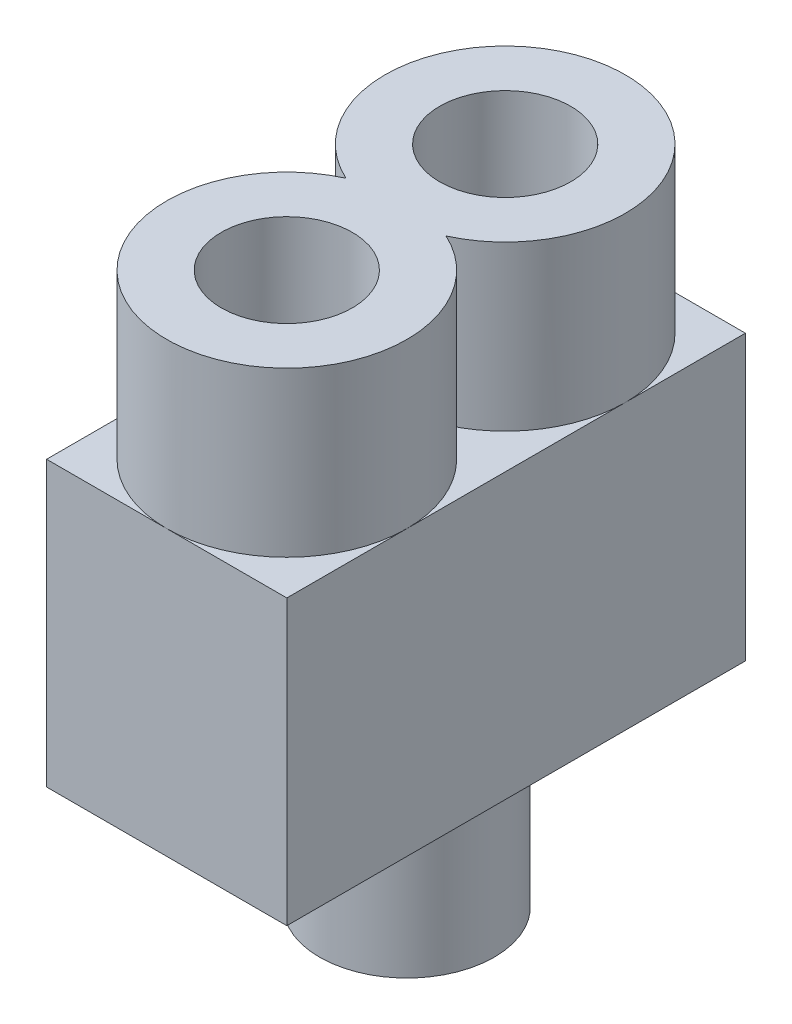
ISO-10303-21;
HEADER;
FILE_DESCRIPTION(('STEP AP214'),'2;1');
FILE_NAME('part.step','',(''),(''),'','','');
FILE_SCHEMA(('AUTOMOTIVE_DESIGN { 1 0 10303 214 1 1 1 1 }'));
ENDSEC;
DATA;
#1=APPLICATION_CONTEXT('core data for automotive mechanical design processes');
#2=APPLICATION_PROTOCOL_DEFINITION('international standard','automotive_design',2000,#1);
#3=PRODUCT_CONTEXT('',#1,'mechanical');
#4=PRODUCT('Part','Part','',(#3));
#5=PRODUCT_RELATED_PRODUCT_CATEGORY('part','',(#4));
#6=PRODUCT_DEFINITION_FORMATION('','',#4);
#7=PRODUCT_DEFINITION_CONTEXT('part definition',#1,'design');
#8=PRODUCT_DEFINITION('design','',#6,#7);
#9=PRODUCT_DEFINITION_SHAPE('','',#8);
#10=(LENGTH_UNIT() NAMED_UNIT(*) SI_UNIT(.MILLI.,.METRE.));
#11=(NAMED_UNIT(*) PLANE_ANGLE_UNIT() SI_UNIT($,.RADIAN.));
#12=(NAMED_UNIT(*) SI_UNIT($,.STERADIAN.) SOLID_ANGLE_UNIT());
#13=UNCERTAINTY_MEASURE_WITH_UNIT(LENGTH_MEASURE(1.E-05),#10,'distance_accuracy_value','');
#14=(GEOMETRIC_REPRESENTATION_CONTEXT(3) GLOBAL_UNCERTAINTY_ASSIGNED_CONTEXT((#13)) GLOBAL_UNIT_ASSIGNED_CONTEXT((#10,
#11,#12)) REPRESENTATION_CONTEXT('',''));
#15=CARTESIAN_POINT('',(0.,0.,0.));
#16=DIRECTION('',(0.,0.,1.));
#17=DIRECTION('',(1.,0.,0.));
#18=AXIS2_PLACEMENT_3D('',#15,#16,#17);
#19=CARTESIAN_POINT('',(-11.,15.,-11.));
#20=DIRECTION('',(0.,1.,0.));
#21=DIRECTION('',(0.,0.,1.));
#22=AXIS2_PLACEMENT_3D('',#19,#20,#21);
#23=PLANE('',#22);
#24=CARTESIAN_POINT('',(0.,15.,9.));
#25=DIRECTION('',(0.,-1.,0.));
#26=DIRECTION('',(0.,0.,-1.));
#27=AXIS2_PLACEMENT_3D('',#24,#25,#26);
#28=CIRCLE('',#27,6.);
#29=CARTESIAN_POINT('',(0.,15.,3.));
#30=VERTEX_POINT('',#29);
#31=EDGE_CURVE('E151',#30,#30,#28,.T.);
#32=ORIENTED_EDGE('',*,*,#31,.T.);
#33=EDGE_LOOP('',(#32));
#34=FACE_BOUND('',#33,.T.);
#35=ADVANCED_FACE('F69',(#34),#23,.F.);
#36=CARTESIAN_POINT('',(-11.,41.,-11.));
#37=DIRECTION('',(0.,1.,0.));
#38=DIRECTION('',(0.,0.,1.));
#39=AXIS2_PLACEMENT_3D('',#36,#37,#38);
#40=PLANE('',#39);
#41=DIRECTION('',(0.,0.,-1.));
#42=VECTOR('',#41,1.);
#43=CARTESIAN_POINT('',(11.,41.,11.));
#44=LINE('',#43,#42);
#45=CARTESIAN_POINT('',(11.,41.,20.));
#46=VERTEX_POINT('',#45);
#47=CARTESIAN_POINT('',(11.,41.,0.));
#48=VERTEX_POINT('',#47);
#49=EDGE_CURVE('E84',#46,#48,#44,.T.);
#50=ORIENTED_EDGE('',*,*,#49,.T.);
#51=CARTESIAN_POINT('',(0.,41.,0.));
#52=DIRECTION('',(0.,-1.,0.));
#53=DIRECTION('',(1.,0.,0.));
#54=AXIS2_PLACEMENT_3D('',#51,#52,#53);
#55=CIRCLE('',#54,11.);
#56=CARTESIAN_POINT('',(4.58257569495584,41.,10.));
#57=VERTEX_POINT('',#56);
#58=EDGE_CURVE('E164',#48,#57,#55,.T.);
#59=ORIENTED_EDGE('',*,*,#58,.T.);
#60=CARTESIAN_POINT('',(0.,41.,20.));
#61=DIRECTION('',(0.,-1.,0.));
#62=DIRECTION('',(1.,0.,0.));
#63=AXIS2_PLACEMENT_3D('',#60,#61,#62);
#64=CIRCLE('',#63,11.);
#65=EDGE_CURVE('E188',#57,#46,#64,.T.);
#66=ORIENTED_EDGE('',*,*,#65,.T.);
#67=EDGE_LOOP('',(#50,#59,#66));
#68=FACE_BOUND('',#67,.T.);
#69=ADVANCED_FACE('F238',(#68),#40,.T.);
#70=CARTESIAN_POINT('',(-4.58257569495584,41.,10.));
#71=VERTEX_POINT('',#70);
#72=CARTESIAN_POINT('',(-11.,41.,0.));
#73=VERTEX_POINT('',#72);
#74=EDGE_CURVE('E156',#71,#73,#55,.T.);
#75=ORIENTED_EDGE('',*,*,#74,.T.);
#76=DIRECTION('',(0.,0.,1.));
#77=VECTOR('',#76,1.);
#78=CARTESIAN_POINT('',(-11.,41.,-11.));
#79=LINE('',#78,#77);
#80=CARTESIAN_POINT('',(-11.,41.,20.));
#81=VERTEX_POINT('',#80);
#82=EDGE_CURVE('E136',#73,#81,#79,.T.);
#83=ORIENTED_EDGE('',*,*,#82,.T.);
#84=EDGE_CURVE('E316',#81,#71,#64,.T.);
#85=ORIENTED_EDGE('',*,*,#84,.T.);
#86=EDGE_LOOP('',(#75,#83,#85));
#87=FACE_BOUND('',#86,.T.);
#88=ADVANCED_FACE('F246',(#87),#40,.T.);
#89=CARTESIAN_POINT('',(-11.,41.,-11.));
#90=VERTEX_POINT('',#89);
#91=EDGE_CURVE('E141',#90,#73,#79,.T.);
#92=ORIENTED_EDGE('',*,*,#91,.T.);
#93=CARTESIAN_POINT('',(0.,41.,-11.));
#94=VERTEX_POINT('',#93);
#95=EDGE_CURVE('E349',#73,#94,#55,.T.);
#96=ORIENTED_EDGE('',*,*,#95,.T.);
#97=DIRECTION('',(-1.,0.,0.));
#98=VECTOR('',#97,1.);
#99=CARTESIAN_POINT('',(11.,41.,-11.));
#100=LINE('',#99,#98);
#101=EDGE_CURVE('E168',#94,#90,#100,.T.);
#102=ORIENTED_EDGE('',*,*,#101,.T.);
#103=EDGE_LOOP('',(#92,#96,#102));
#104=FACE_BOUND('',#103,.T.);
#105=ADVANCED_FACE('F256',(#104),#40,.T.);
#106=CARTESIAN_POINT('',(11.,41.,-11.));
#107=VERTEX_POINT('',#106);
#108=EDGE_CURVE('E129',#107,#94,#100,.T.);
#109=ORIENTED_EDGE('',*,*,#108,.T.);
#110=EDGE_CURVE('E145',#94,#48,#55,.T.);
#111=ORIENTED_EDGE('',*,*,#110,.T.);
#112=EDGE_CURVE('E93',#48,#107,#44,.T.);
#113=ORIENTED_EDGE('',*,*,#112,.T.);
#114=EDGE_LOOP('',(#109,#111,#113));
#115=FACE_BOUND('',#114,.T.);
#116=ADVANCED_FACE('F248',(#115),#40,.T.);
#117=CARTESIAN_POINT('',(0.,15.,9.));
#118=DIRECTION('',(0.,-1.,0.));
#119=DIRECTION('',(1.,0.,0.));
#120=AXIS2_PLACEMENT_3D('',#117,#118,#119);
#121=CIRCLE('',#120,8.);
#122=CARTESIAN_POINT('',(8.,15.,9.));
#123=VERTEX_POINT('',#122);
#124=EDGE_CURVE('E147',#123,#123,#121,.T.);
#125=ORIENTED_EDGE('',*,*,#124,.F.);
#126=EDGE_LOOP('',(#125));
#127=FACE_BOUND('',#126,.T.);
#128=DIRECTION('',(1.,0.,0.));
#129=VECTOR('',#128,1.);
#130=CARTESIAN_POINT('',(0.,15.,31.));
#131=LINE('',#130,#129);
#132=CARTESIAN_POINT('',(-11.,15.,31.));
#133=VERTEX_POINT('',#132);
#134=CARTESIAN_POINT('',(11.,15.,31.));
#135=VERTEX_POINT('',#134);
#136=EDGE_CURVE('E184',#133,#135,#131,.T.);
#137=ORIENTED_EDGE('',*,*,#136,.F.);
#138=DIRECTION('',(0.,0.,1.));
#139=VECTOR('',#138,1.);
#140=CARTESIAN_POINT('',(-11.,15.,0.));
#141=LINE('',#140,#139);
#142=CARTESIAN_POINT('',(-11.,15.,-11.));
#143=VERTEX_POINT('',#142);
#144=EDGE_CURVE('E122',#143,#133,#141,.T.);
#145=ORIENTED_EDGE('',*,*,#144,.F.);
#146=DIRECTION('',(-1.,0.,0.));
#147=VECTOR('',#146,1.);
#148=CARTESIAN_POINT('',(11.,15.,-11.));
#149=LINE('',#148,#147);
#150=CARTESIAN_POINT('',(11.,15.,-11.));
#151=VERTEX_POINT('',#150);
#152=EDGE_CURVE('E121',#151,#143,#149,.T.);
#153=ORIENTED_EDGE('',*,*,#152,.F.);
#154=DIRECTION('',(0.,0.,-1.));
#155=VECTOR('',#154,1.);
#156=CARTESIAN_POINT('',(11.,15.,0.));
#157=LINE('',#156,#155);
#158=EDGE_CURVE('E107',#135,#151,#157,.T.);
#159=ORIENTED_EDGE('',*,*,#158,.F.);
#160=EDGE_LOOP('',(#137,#145,#153,#159));
#161=FACE_BOUND('',#160,.T.);
#162=ADVANCED_FACE('F132',(#127,#161),#23,.F.);
#163=CARTESIAN_POINT('',(-11.,41.,0.));
#164=DIRECTION('',(1.,0.,0.));
#165=DIRECTION('',(0.,0.,-1.));
#166=AXIS2_PLACEMENT_3D('',#163,#164,#165);
#167=PLANE('',#166);
#168=DIRECTION('',(0.,0.,1.));
#169=VECTOR('',#168,1.);
#170=CARTESIAN_POINT('',(-11.,41.,9.));
#171=LINE('',#170,#169);
#172=CARTESIAN_POINT('',(-11.,41.,31.));
#173=VERTEX_POINT('',#172);
#174=EDGE_CURVE('E191',#81,#173,#171,.T.);
#175=ORIENTED_EDGE('',*,*,#174,.F.);
#176=ORIENTED_EDGE('',*,*,#82,.F.);
#177=ORIENTED_EDGE('',*,*,#91,.F.);
#178=DIRECTION('',(0.,-1.,0.));
#179=VECTOR('',#178,1.);
#180=CARTESIAN_POINT('',(-11.,41.,-11.));
#181=LINE('',#180,#179);
#182=EDGE_CURVE('E130',#90,#143,#181,.T.);
#183=ORIENTED_EDGE('',*,*,#182,.T.);
#184=ORIENTED_EDGE('',*,*,#144,.T.);
#185=DIRECTION('',(0.,-1.,0.));
#186=VECTOR('',#185,1.);
#187=CARTESIAN_POINT('',(-11.,41.,31.));
#188=LINE('',#187,#186);
#189=EDGE_CURVE('E177',#173,#133,#188,.T.);
#190=ORIENTED_EDGE('',*,*,#189,.F.);
#191=EDGE_LOOP('',(#175,#176,#177,#183,#184,#190));
#192=FACE_BOUND('',#191,.T.);
#193=ADVANCED_FACE('F71',(#192),#167,.F.);
#194=CARTESIAN_POINT('',(11.,41.,0.));
#195=DIRECTION('',(-1.,0.,0.));
#196=DIRECTION('',(0.,0.,1.));
#197=AXIS2_PLACEMENT_3D('',#194,#195,#196);
#198=PLANE('',#197);
#199=ORIENTED_EDGE('',*,*,#158,.T.);
#200=DIRECTION('',(0.,-1.,0.));
#201=VECTOR('',#200,1.);
#202=CARTESIAN_POINT('',(11.,41.,-11.));
#203=LINE('',#202,#201);
#204=EDGE_CURVE('E110',#107,#151,#203,.T.);
#205=ORIENTED_EDGE('',*,*,#204,.F.);
#206=ORIENTED_EDGE('',*,*,#112,.F.);
#207=ORIENTED_EDGE('',*,*,#49,.F.);
#208=DIRECTION('',(0.,0.,-1.));
#209=VECTOR('',#208,1.);
#210=CARTESIAN_POINT('',(11.,41.,31.));
#211=LINE('',#210,#209);
#212=CARTESIAN_POINT('',(11.,41.,31.));
#213=VERTEX_POINT('',#212);
#214=EDGE_CURVE('E204',#213,#46,#211,.T.);
#215=ORIENTED_EDGE('',*,*,#214,.F.);
#216=DIRECTION('',(0.,-1.,0.));
#217=VECTOR('',#216,1.);
#218=CARTESIAN_POINT('',(11.,41.,31.));
#219=LINE('',#218,#217);
#220=EDGE_CURVE('E115',#213,#135,#219,.T.);
#221=ORIENTED_EDGE('',*,*,#220,.T.);
#222=EDGE_LOOP('',(#199,#205,#206,#207,#215,#221));
#223=FACE_BOUND('',#222,.T.);
#224=ADVANCED_FACE('F109',(#223),#198,.F.);
#225=CARTESIAN_POINT('',(11.,41.,-11.));
#226=DIRECTION('',(0.,0.,1.));
#227=DIRECTION('',(1.,0.,0.));
#228=AXIS2_PLACEMENT_3D('',#225,#226,#227);
#229=PLANE('',#228);
#230=ORIENTED_EDGE('',*,*,#152,.T.);
#231=ORIENTED_EDGE('',*,*,#182,.F.);
#232=ORIENTED_EDGE('',*,*,#101,.F.);
#233=ORIENTED_EDGE('',*,*,#108,.F.);
#234=ORIENTED_EDGE('',*,*,#204,.T.);
#235=EDGE_LOOP('',(#230,#231,#232,#233,#234));
#236=FACE_BOUND('',#235,.T.);
#237=ADVANCED_FACE('F125',(#236),#229,.F.);
#238=CARTESIAN_POINT('',(0.,56.,0.));
#239=DIRECTION('',(0.,-1.,0.));
#240=DIRECTION('',(0.,0.,-1.));
#241=AXIS2_PLACEMENT_3D('',#238,#239,#240);
#242=CYLINDRICAL_SURFACE('',#241,11.);
#243=DIRECTION('',(0.,-1.,0.));
#244=VECTOR('',#243,1.);
#245=CARTESIAN_POINT('',(-4.58257569495584,48.5,10.));
#246=LINE('',#245,#244);
#247=CARTESIAN_POINT('',(-4.58257569495584,56.,10.));
#248=VERTEX_POINT('',#247);
#249=EDGE_CURVE('E210',#248,#71,#246,.T.);
#250=ORIENTED_EDGE('',*,*,#249,.F.);
#251=CARTESIAN_POINT('',(0.,56.,0.));
#252=DIRECTION('',(0.,-1.,0.));
#253=DIRECTION('',(-1.,0.,0.));
#254=AXIS2_PLACEMENT_3D('',#251,#252,#253);
#255=CIRCLE('',#254,11.);
#256=CARTESIAN_POINT('',(4.58257569495584,56.,10.));
#257=VERTEX_POINT('',#256);
#258=EDGE_CURVE('E161',#248,#257,#255,.T.);
#259=ORIENTED_EDGE('',*,*,#258,.T.);
#260=DIRECTION('',(0.,-1.,0.));
#261=VECTOR('',#260,1.);
#262=CARTESIAN_POINT('',(4.58257569495584,48.5,10.));
#263=LINE('',#262,#261);
#264=EDGE_CURVE('E207',#57,#257,#263,.F.);
#265=ORIENTED_EDGE('',*,*,#264,.F.);
#266=ORIENTED_EDGE('',*,*,#58,.F.);
#267=ORIENTED_EDGE('',*,*,#110,.F.);
#268=ORIENTED_EDGE('',*,*,#95,.F.);
#269=ORIENTED_EDGE('',*,*,#74,.F.);
#270=EDGE_LOOP('',(#250,#259,#265,#266,#267,#268,#269));
#271=FACE_BOUND('',#270,.T.);
#272=ADVANCED_FACE('F263',(#271),#242,.T.);
#273=CARTESIAN_POINT('',(0.,56.,0.));
#274=DIRECTION('',(0.,-1.,0.));
#275=DIRECTION('',(0.,0.,-1.));
#276=AXIS2_PLACEMENT_3D('',#273,#274,#275);
#277=PLANE('',#276);
#278=ORIENTED_EDGE('',*,*,#258,.F.);
#279=CARTESIAN_POINT('',(0.,56.,20.));
#280=DIRECTION('',(0.,-1.,0.));
#281=DIRECTION('',(-1.,0.,0.));
#282=AXIS2_PLACEMENT_3D('',#279,#280,#281);
#283=CIRCLE('',#282,11.);
#284=EDGE_CURVE('E192',#257,#248,#283,.T.);
#285=ORIENTED_EDGE('',*,*,#284,.F.);
#286=EDGE_LOOP('',(#278,#285));
#287=FACE_BOUND('',#286,.T.);
#288=CARTESIAN_POINT('',(0.,56.,20.));
#289=DIRECTION('',(0.,1.,0.));
#290=DIRECTION('',(0.,0.,1.));
#291=AXIS2_PLACEMENT_3D('',#288,#289,#290);
#292=CIRCLE('',#291,6.);
#293=CARTESIAN_POINT('',(0.,56.,26.));
#294=VERTEX_POINT('',#293);
#295=EDGE_CURVE('E315',#294,#294,#292,.T.);
#296=ORIENTED_EDGE('',*,*,#295,.F.);
#297=EDGE_LOOP('',(#296));
#298=FACE_BOUND('',#297,.T.);
#299=CARTESIAN_POINT('',(0.,56.,0.));
#300=DIRECTION('',(0.,1.,0.));
#301=DIRECTION('',(0.,0.,1.));
#302=AXIS2_PLACEMENT_3D('',#299,#300,#301);
#303=CIRCLE('',#302,6.);
#304=CARTESIAN_POINT('',(0.,56.,6.));
#305=VERTEX_POINT('',#304);
#306=EDGE_CURVE('E320',#305,#305,#303,.T.);
#307=ORIENTED_EDGE('',*,*,#306,.F.);
#308=EDGE_LOOP('',(#307));
#309=FACE_BOUND('',#308,.T.);
#310=ADVANCED_FACE('F234',(#287,#298,#309),#277,.F.);
#311=CARTESIAN_POINT('',(0.,0.,9.));
#312=DIRECTION('',(0.,-1.,0.));
#313=DIRECTION('',(0.,0.,-1.));
#314=AXIS2_PLACEMENT_3D('',#311,#312,#313);
#315=PLANE('',#314);
#316=CARTESIAN_POINT('',(0.,0.,9.));
#317=DIRECTION('',(0.,-1.,0.));
#318=DIRECTION('',(1.,0.,0.));
#319=AXIS2_PLACEMENT_3D('',#316,#317,#318);
#320=CIRCLE('',#319,8.);
#321=CARTESIAN_POINT('',(8.,0.,9.));
#322=VERTEX_POINT('',#321);
#323=EDGE_CURVE('E160',#322,#322,#320,.T.);
#324=ORIENTED_EDGE('',*,*,#323,.T.);
#325=EDGE_LOOP('',(#324));
#326=FACE_BOUND('',#325,.T.);
#327=CARTESIAN_POINT('',(0.,0.,9.));
#328=DIRECTION('',(0.,-1.,0.));
#329=DIRECTION('',(0.,0.,-1.));
#330=AXIS2_PLACEMENT_3D('',#327,#328,#329);
#331=CIRCLE('',#330,6.);
#332=CARTESIAN_POINT('',(0.,0.,3.));
#333=VERTEX_POINT('',#332);
#334=EDGE_CURVE('E214',#333,#333,#331,.T.);
#335=ORIENTED_EDGE('',*,*,#334,.F.);
#336=EDGE_LOOP('',(#335));
#337=FACE_BOUND('',#336,.T.);
#338=ADVANCED_FACE('F221',(#326,#337),#315,.T.);
#339=CARTESIAN_POINT('',(0.,0.,9.));
#340=DIRECTION('',(0.,1.,0.));
#341=DIRECTION('',(0.,0.,1.));
#342=AXIS2_PLACEMENT_3D('',#339,#340,#341);
#343=CYLINDRICAL_SURFACE('',#342,8.);
#344=ORIENTED_EDGE('',*,*,#323,.F.);
#345=EDGE_LOOP('',(#344));
#346=FACE_BOUND('',#345,.T.);
#347=ORIENTED_EDGE('',*,*,#124,.T.);
#348=EDGE_LOOP('',(#347));
#349=FACE_BOUND('',#348,.T.);
#350=ADVANCED_FACE('F224',(#346,#349),#343,.T.);
#351=CARTESIAN_POINT('',(0.,0.,9.));
#352=DIRECTION('',(0.,1.,0.));
#353=DIRECTION('',(0.,0.,1.));
#354=AXIS2_PLACEMENT_3D('',#351,#352,#353);
#355=CYLINDRICAL_SURFACE('',#354,6.);
#356=ORIENTED_EDGE('',*,*,#334,.T.);
#357=EDGE_LOOP('',(#356));
#358=FACE_BOUND('',#357,.T.);
#359=ORIENTED_EDGE('',*,*,#31,.F.);
#360=EDGE_LOOP('',(#359));
#361=FACE_BOUND('',#360,.T.);
#362=ADVANCED_FACE('F226',(#358,#361),#355,.F.);
#363=CARTESIAN_POINT('',(-11.,41.,9.));
#364=DIRECTION('',(0.,1.,0.));
#365=DIRECTION('',(0.,0.,1.));
#366=AXIS2_PLACEMENT_3D('',#363,#364,#365);
#367=PLANE('',#366);
#368=ORIENTED_EDGE('',*,*,#214,.T.);
#369=CARTESIAN_POINT('',(0.,41.,31.));
#370=VERTEX_POINT('',#369);
#371=EDGE_CURVE('E200',#46,#370,#64,.T.);
#372=ORIENTED_EDGE('',*,*,#371,.T.);
#373=DIRECTION('',(1.,0.,0.));
#374=VECTOR('',#373,1.);
#375=CARTESIAN_POINT('',(-11.,41.,31.));
#376=LINE('',#375,#374);
#377=EDGE_CURVE('E197',#370,#213,#376,.T.);
#378=ORIENTED_EDGE('',*,*,#377,.T.);
#379=EDGE_LOOP('',(#368,#372,#378));
#380=FACE_BOUND('',#379,.T.);
#381=ADVANCED_FACE('F232',(#380),#367,.T.);
#382=EDGE_CURVE('E187',#173,#370,#376,.T.);
#383=ORIENTED_EDGE('',*,*,#382,.T.);
#384=EDGE_CURVE('E211',#370,#81,#64,.T.);
#385=ORIENTED_EDGE('',*,*,#384,.T.);
#386=ORIENTED_EDGE('',*,*,#174,.T.);
#387=EDGE_LOOP('',(#383,#385,#386));
#388=FACE_BOUND('',#387,.T.);
#389=ADVANCED_FACE('F297',(#388),#367,.T.);
#390=CARTESIAN_POINT('',(0.,41.,31.));
#391=DIRECTION('',(0.,0.,-1.));
#392=DIRECTION('',(-1.,0.,0.));
#393=AXIS2_PLACEMENT_3D('',#390,#391,#392);
#394=PLANE('',#393);
#395=ORIENTED_EDGE('',*,*,#136,.T.);
#396=ORIENTED_EDGE('',*,*,#220,.F.);
#397=ORIENTED_EDGE('',*,*,#377,.F.);
#398=ORIENTED_EDGE('',*,*,#382,.F.);
#399=ORIENTED_EDGE('',*,*,#189,.T.);
#400=EDGE_LOOP('',(#395,#396,#397,#398,#399));
#401=FACE_BOUND('',#400,.T.);
#402=ADVANCED_FACE('F183',(#401),#394,.F.);
#403=CARTESIAN_POINT('',(0.,56.,20.));
#404=DIRECTION('',(0.,-1.,0.));
#405=DIRECTION('',(0.,0.,-1.));
#406=AXIS2_PLACEMENT_3D('',#403,#404,#405);
#407=CYLINDRICAL_SURFACE('',#406,11.);
#408=ORIENTED_EDGE('',*,*,#284,.T.);
#409=ORIENTED_EDGE('',*,*,#249,.T.);
#410=ORIENTED_EDGE('',*,*,#84,.F.);
#411=ORIENTED_EDGE('',*,*,#384,.F.);
#412=ORIENTED_EDGE('',*,*,#371,.F.);
#413=ORIENTED_EDGE('',*,*,#65,.F.);
#414=ORIENTED_EDGE('',*,*,#264,.T.);
#415=EDGE_LOOP('',(#408,#409,#410,#411,#412,#413,#414));
#416=FACE_BOUND('',#415,.T.);
#417=ADVANCED_FACE('F289',(#416),#407,.T.);
#418=CARTESIAN_POINT('',(0.,26.,20.));
#419=DIRECTION('',(0.,1.,0.));
#420=DIRECTION('',(0.,0.,1.));
#421=AXIS2_PLACEMENT_3D('',#418,#419,#420);
#422=CYLINDRICAL_SURFACE('',#421,6.);
#423=ORIENTED_EDGE('',*,*,#295,.T.);
#424=EDGE_LOOP('',(#423));
#425=FACE_BOUND('',#424,.T.);
#426=CARTESIAN_POINT('',(0.,41.,20.));
#427=DIRECTION('',(0.,-1.,0.));
#428=DIRECTION('',(0.,0.,-1.));
#429=AXIS2_PLACEMENT_3D('',#426,#427,#428);
#430=CIRCLE('',#429,6.);
#431=CARTESIAN_POINT('',(0.,41.,14.));
#432=VERTEX_POINT('',#431);
#433=EDGE_CURVE('E77',#432,#432,#430,.T.);
#434=ORIENTED_EDGE('',*,*,#433,.T.);
#435=EDGE_LOOP('',(#434));
#436=FACE_BOUND('',#435,.T.);
#437=ADVANCED_FACE('F284',(#425,#436),#422,.F.);
#438=CARTESIAN_POINT('',(0.,41.,20.));
#439=DIRECTION('',(0.,-1.,0.));
#440=DIRECTION('',(0.,0.,-1.));
#441=AXIS2_PLACEMENT_3D('',#438,#439,#440);
#442=PLANE('',#441);
#443=ORIENTED_EDGE('',*,*,#433,.F.);
#444=EDGE_LOOP('',(#443));
#445=FACE_BOUND('',#444,.T.);
#446=ADVANCED_FACE('F276',(#445),#442,.F.);
#447=CARTESIAN_POINT('',(0.,26.,0.));
#448=DIRECTION('',(0.,1.,0.));
#449=DIRECTION('',(0.,0.,1.));
#450=AXIS2_PLACEMENT_3D('',#447,#448,#449);
#451=CYLINDRICAL_SURFACE('',#450,6.);
#452=ORIENTED_EDGE('',*,*,#306,.T.);
#453=EDGE_LOOP('',(#452));
#454=FACE_BOUND('',#453,.T.);
#455=CARTESIAN_POINT('',(0.,41.,0.));
#456=DIRECTION('',(0.,-1.,0.));
#457=DIRECTION('',(0.,0.,-1.));
#458=AXIS2_PLACEMENT_3D('',#455,#456,#457);
#459=CIRCLE('',#458,6.);
#460=CARTESIAN_POINT('',(0.,41.,-6.));
#461=VERTEX_POINT('',#460);
#462=EDGE_CURVE('E12',#461,#461,#459,.T.);
#463=ORIENTED_EDGE('',*,*,#462,.T.);
#464=EDGE_LOOP('',(#463));
#465=FACE_BOUND('',#464,.T.);
#466=ADVANCED_FACE('F270',(#454,#465),#451,.F.);
#467=CARTESIAN_POINT('',(0.,41.,0.));
#468=DIRECTION('',(0.,-1.,0.));
#469=DIRECTION('',(0.,0.,-1.));
#470=AXIS2_PLACEMENT_3D('',#467,#468,#469);
#471=PLANE('',#470);
#472=ORIENTED_EDGE('',*,*,#462,.F.);
#473=EDGE_LOOP('',(#472));
#474=FACE_BOUND('',#473,.T.);
#475=ADVANCED_FACE('F268',(#474),#471,.F.);
#476=CLOSED_SHELL('',(#35,#69,#88,#105,#116,#162,#193,#224,#237,#272,#310,#338,#350,#362,#381,
#389,#402,#417,#437,#446,#466,#475));
#477=MANIFOLD_SOLID_BREP('B2',#476);
#478=ADVANCED_BREP_SHAPE_REPRESENTATION('',(#18,#477),#14);
#479=SHAPE_DEFINITION_REPRESENTATION(#9,#478);
ENDSEC;
END-ISO-10303-21;
